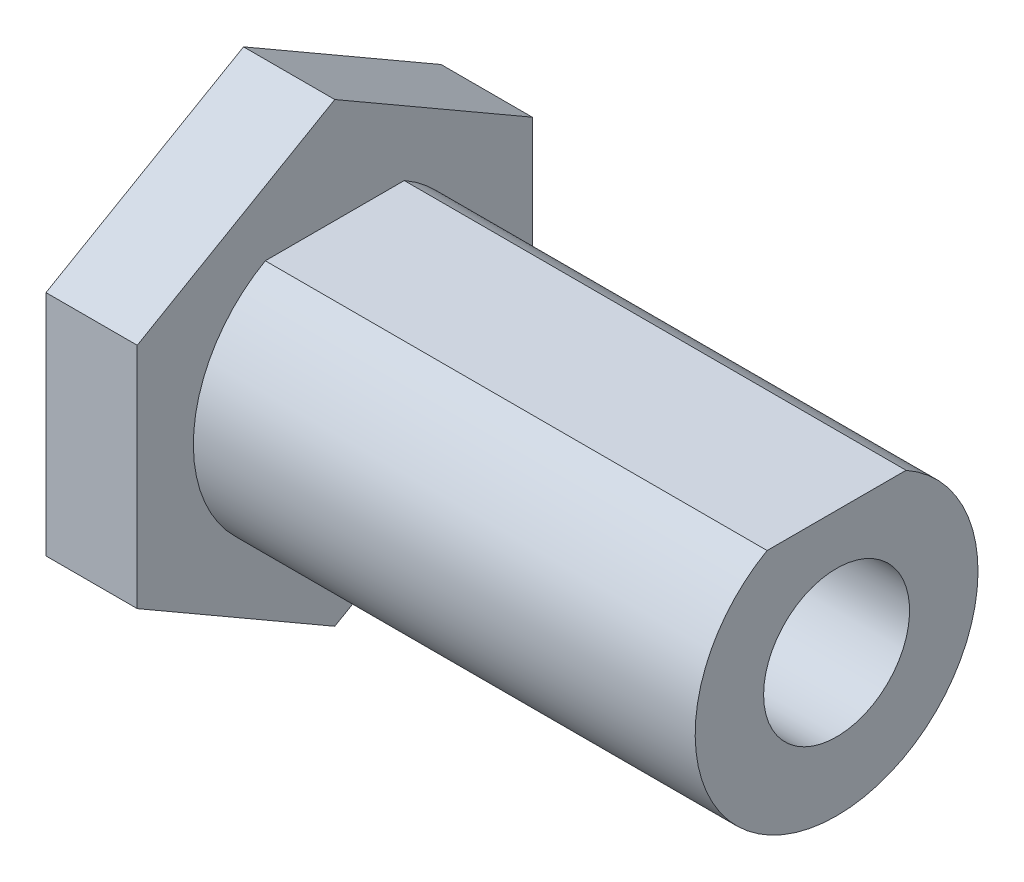
ISO-10303-21;
HEADER;
FILE_DESCRIPTION(('STEP AP214'),'2;1');
FILE_NAME('part.step','',(''),(''),'','','');
FILE_SCHEMA(('AUTOMOTIVE_DESIGN { 1 0 10303 214 1 1 1 1 }'));
ENDSEC;
DATA;
#1=APPLICATION_CONTEXT('core data for automotive mechanical design processes');
#2=APPLICATION_PROTOCOL_DEFINITION('international standard','automotive_design',2000,#1);
#3=PRODUCT_CONTEXT('',#1,'mechanical');
#4=PRODUCT('Part','Part','',(#3));
#5=PRODUCT_RELATED_PRODUCT_CATEGORY('part','',(#4));
#6=PRODUCT_DEFINITION_FORMATION('','',#4);
#7=PRODUCT_DEFINITION_CONTEXT('part definition',#1,'design');
#8=PRODUCT_DEFINITION('design','',#6,#7);
#9=PRODUCT_DEFINITION_SHAPE('','',#8);
#10=(LENGTH_UNIT() NAMED_UNIT(*) SI_UNIT(.MILLI.,.METRE.));
#11=(NAMED_UNIT(*) PLANE_ANGLE_UNIT() SI_UNIT($,.RADIAN.));
#12=(NAMED_UNIT(*) SI_UNIT($,.STERADIAN.) SOLID_ANGLE_UNIT());
#13=UNCERTAINTY_MEASURE_WITH_UNIT(LENGTH_MEASURE(1.E-05),#10,'distance_accuracy_value','');
#14=(GEOMETRIC_REPRESENTATION_CONTEXT(3) GLOBAL_UNCERTAINTY_ASSIGNED_CONTEXT((#13)) GLOBAL_UNIT_ASSIGNED_CONTEXT((#10,
#11,#12)) REPRESENTATION_CONTEXT('',''));
#15=CARTESIAN_POINT('',(0.,0.,0.));
#16=DIRECTION('',(0.,0.,1.));
#17=DIRECTION('',(1.,0.,0.));
#18=AXIS2_PLACEMENT_3D('',#15,#16,#17);
#19=CARTESIAN_POINT('',(2.,5.,0.));
#20=DIRECTION('',(-1.,0.,0.));
#21=DIRECTION('',(0.,0.,1.));
#22=AXIS2_PLACEMENT_3D('',#19,#20,#21);
#23=PLANE('',#22);
#24=CARTESIAN_POINT('',(2.,0.,0.));
#25=DIRECTION('',(-1.,0.,0.));
#26=DIRECTION('',(0.,0.,1.));
#27=AXIS2_PLACEMENT_3D('',#24,#25,#26);
#28=CIRCLE('',#27,3.1);
#29=CARTESIAN_POINT('',(2.,2.7,-1.52315462117278));
#30=VERTEX_POINT('',#29);
#31=CARTESIAN_POINT('',(2.,2.7,1.52315462117278));
#32=VERTEX_POINT('',#31);
#33=EDGE_CURVE('E110',#30,#32,#28,.T.);
#34=ORIENTED_EDGE('',*,*,#33,.T.);
#35=DIRECTION('',(0.,0.,-1.));
#36=VECTOR('',#35,1.);
#37=CARTESIAN_POINT('',(2.,2.7,-1.52315462117278));
#38=LINE('',#37,#36);
#39=EDGE_CURVE('E100',#32,#30,#38,.T.);
#40=ORIENTED_EDGE('',*,*,#39,.T.);
#41=EDGE_LOOP('',(#34,#40));
#42=FACE_BOUND('',#41,.T.);
#43=DIRECTION('',(0.,-0.499999999999995,0.866025403784442));
#44=VECTOR('',#43,1.);
#45=CARTESIAN_POINT('',(2.,-2.50000000000005,-4.33012701892216));
#46=LINE('',#45,#44);
#47=CARTESIAN_POINT('',(2.,-2.50000000000005,-4.33012701892216));
#48=VERTEX_POINT('',#47);
#49=CARTESIAN_POINT('',(2.,-5.,0.));
#50=VERTEX_POINT('',#49);
#51=EDGE_CURVE('E12',#48,#50,#46,.T.);
#52=ORIENTED_EDGE('',*,*,#51,.F.);
#53=DIRECTION('',(0.,-1.,0.));
#54=VECTOR('',#53,1.);
#55=CARTESIAN_POINT('',(2.,4.99999999999995,-4.33012701892224));
#56=LINE('',#55,#54);
#57=CARTESIAN_POINT('',(2.,2.49999999999996,-4.33012701892222));
#58=VERTEX_POINT('',#57);
#59=EDGE_CURVE('E41',#58,#48,#56,.T.);
#60=ORIENTED_EDGE('',*,*,#59,.F.);
#61=DIRECTION('',(0.,-0.500000000000007,-0.866025403784435));
#62=VECTOR('',#61,1.);
#63=CARTESIAN_POINT('',(2.,5.,0.));
#64=LINE('',#63,#62);
#65=CARTESIAN_POINT('',(2.,5.,0.));
#66=VERTEX_POINT('',#65);
#67=EDGE_CURVE('E125',#66,#58,#64,.T.);
#68=ORIENTED_EDGE('',*,*,#67,.F.);
#69=DIRECTION('',(0.,0.499999999999995,-0.866025403784442));
#70=VECTOR('',#69,1.);
#71=CARTESIAN_POINT('',(2.,5.,0.));
#72=LINE('',#71,#70);
#73=CARTESIAN_POINT('',(2.,2.50000000000002,4.33012701892218));
#74=VERTEX_POINT('',#73);
#75=EDGE_CURVE('E123',#74,#66,#72,.T.);
#76=ORIENTED_EDGE('',*,*,#75,.F.);
#77=DIRECTION('',(0.,1.,0.));
#78=VECTOR('',#77,1.);
#79=CARTESIAN_POINT('',(2.,5.00000000000002,4.33012701892217));
#80=LINE('',#79,#78);
#81=CARTESIAN_POINT('',(2.,-2.49999999999999,4.3301270189222));
#82=VERTEX_POINT('',#81);
#83=EDGE_CURVE('E116',#82,#74,#80,.T.);
#84=ORIENTED_EDGE('',*,*,#83,.F.);
#85=DIRECTION('',(0.,0.500000000000001,0.866025403784438));
#86=VECTOR('',#85,1.);
#87=CARTESIAN_POINT('',(2.,-2.49999999999999,4.3301270189222));
#88=LINE('',#87,#86);
#89=EDGE_CURVE('E113',#50,#82,#88,.T.);
#90=ORIENTED_EDGE('',*,*,#89,.F.);
#91=EDGE_LOOP('',(#52,#60,#68,#76,#84,#90));
#92=FACE_BOUND('',#91,.T.);
#93=ADVANCED_FACE('F33',(#42,#92),#23,.F.);
#94=CARTESIAN_POINT('',(0.,0.,0.));
#95=DIRECTION('',(-1.,0.,0.));
#96=DIRECTION('',(0.,0.,1.));
#97=AXIS2_PLACEMENT_3D('',#94,#95,#96);
#98=CYLINDRICAL_SURFACE('',#97,3.1);
#99=CARTESIAN_POINT('',(13.,0.,0.));
#100=DIRECTION('',(-1.,0.,0.));
#101=DIRECTION('',(0.,0.,1.));
#102=AXIS2_PLACEMENT_3D('',#99,#100,#101);
#103=CIRCLE('',#102,3.1);
#104=CARTESIAN_POINT('',(13.,2.7,-1.52315462117278));
#105=VERTEX_POINT('',#104);
#106=CARTESIAN_POINT('',(13.,2.7,1.52315462117278));
#107=VERTEX_POINT('',#106);
#108=EDGE_CURVE('E114',#105,#107,#103,.T.);
#109=ORIENTED_EDGE('',*,*,#108,.T.);
#110=DIRECTION('',(1.,0.,0.));
#111=VECTOR('',#110,1.);
#112=CARTESIAN_POINT('',(-1.07245829914745,2.7,1.52315462117278));
#113=LINE('',#112,#111);
#114=EDGE_CURVE('E48',#32,#107,#113,.T.);
#115=ORIENTED_EDGE('',*,*,#114,.F.);
#116=ORIENTED_EDGE('',*,*,#33,.F.);
#117=DIRECTION('',(1.,0.,0.));
#118=VECTOR('',#117,1.);
#119=CARTESIAN_POINT('',(-1.07245829914745,2.7,-1.52315462117278));
#120=LINE('',#119,#118);
#121=EDGE_CURVE('E97',#30,#105,#120,.T.);
#122=ORIENTED_EDGE('',*,*,#121,.T.);
#123=EDGE_LOOP('',(#109,#115,#116,#122));
#124=FACE_BOUND('',#123,.T.);
#125=ADVANCED_FACE('F112',(#124),#98,.T.);
#126=CARTESIAN_POINT('',(13.,3.1,0.));
#127=DIRECTION('',(-1.,0.,0.));
#128=DIRECTION('',(0.,0.,1.));
#129=AXIS2_PLACEMENT_3D('',#126,#127,#128);
#130=PLANE('',#129);
#131=CARTESIAN_POINT('',(13.,0.,0.));
#132=DIRECTION('',(-1.,0.,0.));
#133=DIRECTION('',(0.,0.,1.));
#134=AXIS2_PLACEMENT_3D('',#131,#132,#133);
#135=CIRCLE('',#134,1.6);
#136=CARTESIAN_POINT('',(13.,0.,1.6));
#137=VERTEX_POINT('',#136);
#138=EDGE_CURVE('E175',#137,#137,#135,.T.);
#139=ORIENTED_EDGE('',*,*,#138,.T.);
#140=EDGE_LOOP('',(#139));
#141=FACE_BOUND('',#140,.T.);
#142=ORIENTED_EDGE('',*,*,#108,.F.);
#143=DIRECTION('',(0.,0.,-1.));
#144=VECTOR('',#143,1.);
#145=CARTESIAN_POINT('',(13.,2.7,-1.52315462117278));
#146=LINE('',#145,#144);
#147=EDGE_CURVE('E101',#107,#105,#146,.T.);
#148=ORIENTED_EDGE('',*,*,#147,.F.);
#149=EDGE_LOOP('',(#142,#148));
#150=FACE_BOUND('',#149,.T.);
#151=ADVANCED_FACE('F181',(#141,#150),#130,.F.);
#152=CARTESIAN_POINT('',(10.,-2.50000000000005,-4.33012701892216));
#153=DIRECTION('',(0.,-0.866025403784442,-0.499999999999995));
#154=DIRECTION('',(0.,0.499999999999995,-0.866025403784442));
#155=AXIS2_PLACEMENT_3D('',#152,#153,#154);
#156=PLANE('',#155);
#157=ORIENTED_EDGE('',*,*,#51,.T.);
#158=DIRECTION('',(-1.,0.,0.));
#159=VECTOR('',#158,1.);
#160=CARTESIAN_POINT('',(10.,-5.,0.));
#161=LINE('',#160,#159);
#162=CARTESIAN_POINT('',(0.,-5.,0.));
#163=VERTEX_POINT('',#162);
#164=EDGE_CURVE('E150',#50,#163,#161,.T.);
#165=ORIENTED_EDGE('',*,*,#164,.T.);
#166=DIRECTION('',(0.,-0.499999999999995,0.866025403784442));
#167=VECTOR('',#166,1.);
#168=CARTESIAN_POINT('',(0.,-2.50000000000005,-4.33012701892216));
#169=LINE('',#168,#167);
#170=CARTESIAN_POINT('',(0.,-2.50000000000005,-4.33012701892216));
#171=VERTEX_POINT('',#170);
#172=EDGE_CURVE('E140',#171,#163,#169,.T.);
#173=ORIENTED_EDGE('',*,*,#172,.F.);
#174=DIRECTION('',(-1.,0.,0.));
#175=VECTOR('',#174,1.);
#176=CARTESIAN_POINT('',(10.,-2.50000000000005,-4.33012701892216));
#177=LINE('',#176,#175);
#178=EDGE_CURVE('E118',#48,#171,#177,.T.);
#179=ORIENTED_EDGE('',*,*,#178,.F.);
#180=EDGE_LOOP('',(#157,#165,#173,#179));
#181=FACE_BOUND('',#180,.T.);
#182=ADVANCED_FACE('F137',(#181),#156,.T.);
#183=CARTESIAN_POINT('',(10.,2.49999999999996,-4.33012701892222));
#184=DIRECTION('',(0.,0.,-1.));
#185=DIRECTION('',(0.,1.,0.));
#186=AXIS2_PLACEMENT_3D('',#183,#184,#185);
#187=PLANE('',#186);
#188=ORIENTED_EDGE('',*,*,#59,.T.);
#189=ORIENTED_EDGE('',*,*,#178,.T.);
#190=DIRECTION('',(0.,-1.,0.));
#191=VECTOR('',#190,1.);
#192=CARTESIAN_POINT('',(0.,2.49999999999996,-4.33012701892222));
#193=LINE('',#192,#191);
#194=CARTESIAN_POINT('',(0.,2.49999999999996,-4.33012701892222));
#195=VERTEX_POINT('',#194);
#196=EDGE_CURVE('E157',#195,#171,#193,.T.);
#197=ORIENTED_EDGE('',*,*,#196,.F.);
#198=DIRECTION('',(-1.,0.,0.));
#199=VECTOR('',#198,1.);
#200=CARTESIAN_POINT('',(10.,2.49999999999996,-4.33012701892222));
#201=LINE('',#200,#199);
#202=EDGE_CURVE('E133',#58,#195,#201,.T.);
#203=ORIENTED_EDGE('',*,*,#202,.F.);
#204=EDGE_LOOP('',(#188,#189,#197,#203));
#205=FACE_BOUND('',#204,.T.);
#206=ADVANCED_FACE('F130',(#205),#187,.T.);
#207=CARTESIAN_POINT('',(10.,5.,0.));
#208=DIRECTION('',(0.,0.866025403784435,-0.500000000000007));
#209=DIRECTION('',(0.,0.500000000000007,0.866025403784435));
#210=AXIS2_PLACEMENT_3D('',#207,#208,#209);
#211=PLANE('',#210);
#212=ORIENTED_EDGE('',*,*,#67,.T.);
#213=ORIENTED_EDGE('',*,*,#202,.T.);
#214=DIRECTION('',(0.,-0.500000000000007,-0.866025403784435));
#215=VECTOR('',#214,1.);
#216=CARTESIAN_POINT('',(0.,5.,0.));
#217=LINE('',#216,#215);
#218=CARTESIAN_POINT('',(0.,5.,0.));
#219=VERTEX_POINT('',#218);
#220=EDGE_CURVE('E162',#219,#195,#217,.T.);
#221=ORIENTED_EDGE('',*,*,#220,.F.);
#222=DIRECTION('',(-1.,0.,0.));
#223=VECTOR('',#222,1.);
#224=CARTESIAN_POINT('',(10.,5.,0.));
#225=LINE('',#224,#223);
#226=EDGE_CURVE('E155',#66,#219,#225,.T.);
#227=ORIENTED_EDGE('',*,*,#226,.F.);
#228=EDGE_LOOP('',(#212,#213,#221,#227));
#229=FACE_BOUND('',#228,.T.);
#230=ADVANCED_FACE('F214',(#229),#211,.T.);
#231=CARTESIAN_POINT('',(10.,2.50000000000002,4.33012701892218));
#232=DIRECTION('',(0.,0.866025403784442,0.499999999999995));
#233=DIRECTION('',(0.,-0.499999999999995,0.866025403784442));
#234=AXIS2_PLACEMENT_3D('',#231,#232,#233);
#235=PLANE('',#234);
#236=ORIENTED_EDGE('',*,*,#75,.T.);
#237=ORIENTED_EDGE('',*,*,#226,.T.);
#238=DIRECTION('',(0.,0.499999999999995,-0.866025403784442));
#239=VECTOR('',#238,1.);
#240=CARTESIAN_POINT('',(0.,2.50000000000002,4.33012701892218));
#241=LINE('',#240,#239);
#242=CARTESIAN_POINT('',(0.,2.50000000000002,4.33012701892218));
#243=VERTEX_POINT('',#242);
#244=EDGE_CURVE('E165',#243,#219,#241,.T.);
#245=ORIENTED_EDGE('',*,*,#244,.F.);
#246=DIRECTION('',(-1.,0.,0.));
#247=VECTOR('',#246,1.);
#248=CARTESIAN_POINT('',(10.,2.50000000000002,4.33012701892218));
#249=LINE('',#248,#247);
#250=EDGE_CURVE('E153',#74,#243,#249,.T.);
#251=ORIENTED_EDGE('',*,*,#250,.F.);
#252=EDGE_LOOP('',(#236,#237,#245,#251));
#253=FACE_BOUND('',#252,.T.);
#254=ADVANCED_FACE('F211',(#253),#235,.T.);
#255=CARTESIAN_POINT('',(10.,-2.49999999999999,4.3301270189222));
#256=DIRECTION('',(0.,0.,1.));
#257=DIRECTION('',(0.,-1.,0.));
#258=AXIS2_PLACEMENT_3D('',#255,#256,#257);
#259=PLANE('',#258);
#260=ORIENTED_EDGE('',*,*,#83,.T.);
#261=ORIENTED_EDGE('',*,*,#250,.T.);
#262=DIRECTION('',(0.,1.,0.));
#263=VECTOR('',#262,1.);
#264=CARTESIAN_POINT('',(0.,-2.49999999999999,4.3301270189222));
#265=LINE('',#264,#263);
#266=CARTESIAN_POINT('',(0.,-2.49999999999999,4.3301270189222));
#267=VERTEX_POINT('',#266);
#268=EDGE_CURVE('E56',#267,#243,#265,.T.);
#269=ORIENTED_EDGE('',*,*,#268,.F.);
#270=DIRECTION('',(-1.,0.,0.));
#271=VECTOR('',#270,1.);
#272=CARTESIAN_POINT('',(10.,-2.49999999999999,4.3301270189222));
#273=LINE('',#272,#271);
#274=EDGE_CURVE('E148',#82,#267,#273,.T.);
#275=ORIENTED_EDGE('',*,*,#274,.F.);
#276=EDGE_LOOP('',(#260,#261,#269,#275));
#277=FACE_BOUND('',#276,.T.);
#278=ADVANCED_FACE('F151',(#277),#259,.T.);
#279=CARTESIAN_POINT('',(10.,-5.,0.));
#280=DIRECTION('',(0.,-0.866025403784438,0.500000000000001));
#281=DIRECTION('',(0.,-0.500000000000001,-0.866025403784438));
#282=AXIS2_PLACEMENT_3D('',#279,#280,#281);
#283=PLANE('',#282);
#284=ORIENTED_EDGE('',*,*,#89,.T.);
#285=ORIENTED_EDGE('',*,*,#274,.T.);
#286=DIRECTION('',(0.,0.500000000000001,0.866025403784438));
#287=VECTOR('',#286,1.);
#288=CARTESIAN_POINT('',(0.,-5.,0.));
#289=LINE('',#288,#287);
#290=EDGE_CURVE('E169',#163,#267,#289,.T.);
#291=ORIENTED_EDGE('',*,*,#290,.F.);
#292=ORIENTED_EDGE('',*,*,#164,.F.);
#293=EDGE_LOOP('',(#284,#285,#291,#292));
#294=FACE_BOUND('',#293,.T.);
#295=ADVANCED_FACE('F146',(#294),#283,.T.);
#296=CARTESIAN_POINT('',(0.,0.,0.));
#297=DIRECTION('',(1.,0.,0.));
#298=DIRECTION('',(0.,0.,-1.));
#299=AXIS2_PLACEMENT_3D('',#296,#297,#298);
#300=PLANE('',#299);
#301=ORIENTED_EDGE('',*,*,#172,.T.);
#302=ORIENTED_EDGE('',*,*,#290,.T.);
#303=ORIENTED_EDGE('',*,*,#268,.T.);
#304=ORIENTED_EDGE('',*,*,#244,.T.);
#305=ORIENTED_EDGE('',*,*,#220,.T.);
#306=ORIENTED_EDGE('',*,*,#196,.T.);
#307=EDGE_LOOP('',(#301,#302,#303,#304,#305,#306));
#308=FACE_BOUND('',#307,.T.);
#309=ADVANCED_FACE('F35',(#308),#300,.F.);
#310=CARTESIAN_POINT('',(0.,0.,0.));
#311=DIRECTION('',(-1.,0.,0.));
#312=DIRECTION('',(0.,0.,1.));
#313=AXIS2_PLACEMENT_3D('',#310,#311,#312);
#314=CYLINDRICAL_SURFACE('',#313,1.6);
#315=CARTESIAN_POINT('',(1.5,0.,0.));
#316=DIRECTION('',(1.,0.,0.));
#317=DIRECTION('',(0.,0.,-1.));
#318=AXIS2_PLACEMENT_3D('',#315,#316,#317);
#319=CIRCLE('',#318,1.6);
#320=CARTESIAN_POINT('',(1.5,0.,-1.6));
#321=VERTEX_POINT('',#320);
#322=EDGE_CURVE('E172',#321,#321,#319,.F.);
#323=ORIENTED_EDGE('',*,*,#322,.T.);
#324=EDGE_LOOP('',(#323));
#325=FACE_BOUND('',#324,.T.);
#326=ORIENTED_EDGE('',*,*,#138,.F.);
#327=EDGE_LOOP('',(#326));
#328=FACE_BOUND('',#327,.T.);
#329=ADVANCED_FACE('F184',(#325,#328),#314,.F.);
#330=CARTESIAN_POINT('',(1.5,0.,0.));
#331=DIRECTION('',(1.,0.,0.));
#332=DIRECTION('',(0.,0.,-1.));
#333=AXIS2_PLACEMENT_3D('',#330,#331,#332);
#334=PLANE('',#333);
#335=ORIENTED_EDGE('',*,*,#322,.F.);
#336=EDGE_LOOP('',(#335));
#337=FACE_BOUND('',#336,.T.);
#338=ADVANCED_FACE('F186',(#337),#334,.T.);
#339=CARTESIAN_POINT('',(-1.07245829914745,2.7,-1.52315462117278));
#340=DIRECTION('',(0.,-1.,0.));
#341=DIRECTION('',(0.,0.,-1.));
#342=AXIS2_PLACEMENT_3D('',#339,#340,#341);
#343=PLANE('',#342);
#344=ORIENTED_EDGE('',*,*,#114,.T.);
#345=ORIENTED_EDGE('',*,*,#147,.T.);
#346=ORIENTED_EDGE('',*,*,#121,.F.);
#347=ORIENTED_EDGE('',*,*,#39,.F.);
#348=EDGE_LOOP('',(#344,#345,#346,#347));
#349=FACE_BOUND('',#348,.T.);
#350=ADVANCED_FACE('F99',(#349),#343,.F.);
#351=CLOSED_SHELL('',(#93,#125,#151,#182,#206,#230,#254,#278,#295,#309,#329,#338,#350));
#352=MANIFOLD_SOLID_BREP('B2',#351);
#353=ADVANCED_BREP_SHAPE_REPRESENTATION('',(#18,#352),#14);
#354=SHAPE_DEFINITION_REPRESENTATION(#9,#353);
ENDSEC;
END-ISO-10303-21;
